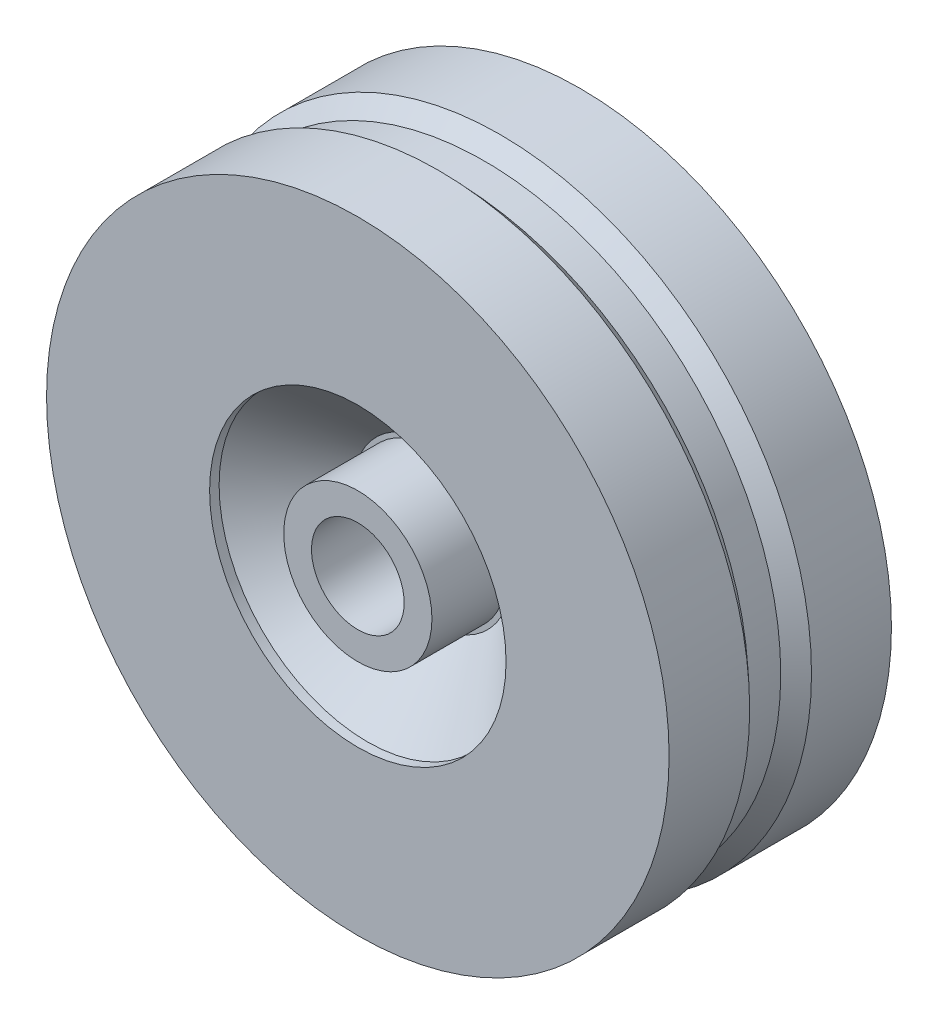
ISO-10303-21;
HEADER;
FILE_DESCRIPTION(('STEP AP214'),'2;1');
FILE_NAME('part.step','',(''),(''),'','','');
FILE_SCHEMA(('AUTOMOTIVE_DESIGN { 1 0 10303 214 1 1 1 1 }'));
ENDSEC;
DATA;
#1=APPLICATION_CONTEXT('core data for automotive mechanical design processes');
#2=APPLICATION_PROTOCOL_DEFINITION('international standard','automotive_design',2000,#1);
#3=PRODUCT_CONTEXT('',#1,'mechanical');
#4=PRODUCT('Part','Part','',(#3));
#5=PRODUCT_RELATED_PRODUCT_CATEGORY('part','',(#4));
#6=PRODUCT_DEFINITION_FORMATION('','',#4);
#7=PRODUCT_DEFINITION_CONTEXT('part definition',#1,'design');
#8=PRODUCT_DEFINITION('design','',#6,#7);
#9=PRODUCT_DEFINITION_SHAPE('','',#8);
#10=(LENGTH_UNIT() NAMED_UNIT(*) SI_UNIT(.MILLI.,.METRE.));
#11=(NAMED_UNIT(*) PLANE_ANGLE_UNIT() SI_UNIT($,.RADIAN.));
#12=(NAMED_UNIT(*) SI_UNIT($,.STERADIAN.) SOLID_ANGLE_UNIT());
#13=UNCERTAINTY_MEASURE_WITH_UNIT(LENGTH_MEASURE(1.E-05),#10,'distance_accuracy_value','');
#14=(GEOMETRIC_REPRESENTATION_CONTEXT(3) GLOBAL_UNCERTAINTY_ASSIGNED_CONTEXT((#13)) GLOBAL_UNIT_ASSIGNED_CONTEXT((#10,
#11,#12)) REPRESENTATION_CONTEXT('',''));
#15=CARTESIAN_POINT('',(0.,0.,0.));
#16=DIRECTION('',(0.,0.,1.));
#17=DIRECTION('',(1.,0.,0.));
#18=AXIS2_PLACEMENT_3D('',#15,#16,#17);
#19=CARTESIAN_POINT('',(0.,0.,10.));
#20=DIRECTION('',(0.,0.,1.));
#21=DIRECTION('',(1.,0.,0.));
#22=AXIS2_PLACEMENT_3D('',#19,#20,#21);
#23=PLANE('',#22);
#24=CARTESIAN_POINT('',(0.,0.,10.));
#25=DIRECTION('',(0.,0.,1.));
#26=DIRECTION('',(1.,0.,0.));
#27=AXIS2_PLACEMENT_3D('',#24,#25,#26);
#28=CIRCLE('',#27,5.);
#29=CARTESIAN_POINT('',(5.,0.,10.));
#30=VERTEX_POINT('',#29);
#31=EDGE_CURVE('E59',#30,#30,#28,.T.);
#32=ORIENTED_EDGE('',*,*,#31,.F.);
#33=EDGE_LOOP('',(#32));
#34=FACE_BOUND('',#33,.T.);
#35=CARTESIAN_POINT('',(0.,0.,10.));
#36=DIRECTION('',(0.,0.,1.));
#37=DIRECTION('',(1.,0.,0.));
#38=AXIS2_PLACEMENT_3D('',#35,#36,#37);
#39=CIRCLE('',#38,5.31076107784422);
#40=CARTESIAN_POINT('',(5.31076107784422,0.,10.));
#41=VERTEX_POINT('',#40);
#42=EDGE_CURVE('E46',#41,#41,#39,.F.);
#43=ORIENTED_EDGE('',*,*,#42,.F.);
#44=EDGE_LOOP('',(#43));
#45=FACE_BOUND('',#44,.T.);
#46=ADVANCED_FACE('F35',(#34,#45),#23,.T.);
#47=CARTESIAN_POINT('',(0.,0.,5.));
#48=DIRECTION('',(0.,0.,-1.));
#49=DIRECTION('',(1.,0.,0.));
#50=AXIS2_PLACEMENT_3D('',#47,#48,#49);
#51=PLANE('',#50);
#52=CARTESIAN_POINT('',(0.,0.,5.));
#53=DIRECTION('',(0.,0.,1.));
#54=DIRECTION('',(1.,0.,0.));
#55=AXIS2_PLACEMENT_3D('',#52,#53,#54);
#56=CIRCLE('',#55,5.);
#57=CARTESIAN_POINT('',(5.,0.,5.));
#58=VERTEX_POINT('',#57);
#59=EDGE_CURVE('E65',#58,#58,#56,.T.);
#60=ORIENTED_EDGE('',*,*,#59,.T.);
#61=EDGE_LOOP('',(#60));
#62=FACE_BOUND('',#61,.T.);
#63=CARTESIAN_POINT('',(0.,0.,5.));
#64=DIRECTION('',(0.,0.,-1.));
#65=DIRECTION('',(-1.,0.,0.));
#66=AXIS2_PLACEMENT_3D('',#63,#64,#65);
#67=CIRCLE('',#66,6.34806339295763);
#68=CARTESIAN_POINT('',(-6.34806339295763,0.,5.));
#69=VERTEX_POINT('',#68);
#70=EDGE_CURVE('E50',#69,#69,#67,.F.);
#71=ORIENTED_EDGE('',*,*,#70,.F.);
#72=EDGE_LOOP('',(#71));
#73=FACE_BOUND('',#72,.T.);
#74=ADVANCED_FACE('F121',(#62,#73),#51,.T.);
#75=CARTESIAN_POINT('',(0.,0.,0.));
#76=DIRECTION('',(0.,0.,1.));
#77=DIRECTION('',(1.,0.,0.));
#78=AXIS2_PLACEMENT_3D('',#75,#76,#77);
#79=PLANE('',#78);
#80=CARTESIAN_POINT('',(0.,0.,0.));
#81=DIRECTION('',(0.,0.,1.));
#82=DIRECTION('',(1.,0.,0.));
#83=AXIS2_PLACEMENT_3D('',#80,#81,#82);
#84=CIRCLE('',#83,3.125);
#85=CARTESIAN_POINT('',(3.125,0.,0.));
#86=VERTEX_POINT('',#85);
#87=EDGE_CURVE('E56',#86,#86,#84,.T.);
#88=ORIENTED_EDGE('',*,*,#87,.T.);
#89=EDGE_LOOP('',(#88));
#90=FACE_BOUND('',#89,.T.);
#91=CARTESIAN_POINT('',(0.,0.,0.));
#92=DIRECTION('',(0.,0.,1.));
#93=DIRECTION('',(1.,0.,0.));
#94=AXIS2_PLACEMENT_3D('',#91,#92,#93);
#95=CIRCLE('',#94,5.);
#96=CARTESIAN_POINT('',(5.,0.,0.));
#97=VERTEX_POINT('',#96);
#98=EDGE_CURVE('E68',#97,#97,#95,.T.);
#99=ORIENTED_EDGE('',*,*,#98,.F.);
#100=EDGE_LOOP('',(#99));
#101=FACE_BOUND('',#100,.T.);
#102=ADVANCED_FACE('F106',(#90,#101),#79,.F.);
#103=CARTESIAN_POINT('',(0.,0.,15.));
#104=DIRECTION('',(0.,0.,1.));
#105=DIRECTION('',(1.,0.,0.));
#106=AXIS2_PLACEMENT_3D('',#103,#104,#105);
#107=PLANE('',#106);
#108=CARTESIAN_POINT('',(0.,0.,15.));
#109=DIRECTION('',(0.,0.,1.));
#110=DIRECTION('',(1.,0.,0.));
#111=AXIS2_PLACEMENT_3D('',#108,#109,#110);
#112=CIRCLE('',#111,3.125);
#113=CARTESIAN_POINT('',(3.125,0.,15.));
#114=VERTEX_POINT('',#113);
#115=EDGE_CURVE('E55',#114,#114,#112,.T.);
#116=ORIENTED_EDGE('',*,*,#115,.F.);
#117=EDGE_LOOP('',(#116));
#118=FACE_BOUND('',#117,.T.);
#119=CARTESIAN_POINT('',(0.,0.,15.));
#120=DIRECTION('',(0.,0.,1.));
#121=DIRECTION('',(1.,0.,0.));
#122=AXIS2_PLACEMENT_3D('',#119,#120,#121);
#123=CIRCLE('',#122,5.);
#124=CARTESIAN_POINT('',(5.,0.,15.));
#125=VERTEX_POINT('',#124);
#126=EDGE_CURVE('E62',#125,#125,#123,.T.);
#127=ORIENTED_EDGE('',*,*,#126,.T.);
#128=EDGE_LOOP('',(#127));
#129=FACE_BOUND('',#128,.T.);
#130=ADVANCED_FACE('F137',(#118,#129),#107,.T.);
#131=CARTESIAN_POINT('',(0.,0.,15.));
#132=DIRECTION('',(0.,0.,-1.));
#133=DIRECTION('',(-1.,0.,0.));
#134=AXIS2_PLACEMENT_3D('',#131,#132,#133);
#135=CYLINDRICAL_SURFACE('',#134,3.125);
#136=ORIENTED_EDGE('',*,*,#115,.T.);
#137=EDGE_LOOP('',(#136));
#138=FACE_BOUND('',#137,.T.);
#139=ORIENTED_EDGE('',*,*,#87,.F.);
#140=EDGE_LOOP('',(#139));
#141=FACE_BOUND('',#140,.T.);
#142=ADVANCED_FACE('F134',(#138,#141),#135,.F.);
#143=CARTESIAN_POINT('',(0.,0.,10.));
#144=DIRECTION('',(0.,0.,1.));
#145=DIRECTION('',(1.,0.,0.));
#146=AXIS2_PLACEMENT_3D('',#143,#144,#145);
#147=CYLINDRICAL_SURFACE('',#146,5.);
#148=ORIENTED_EDGE('',*,*,#31,.T.);
#149=EDGE_LOOP('',(#148));
#150=FACE_BOUND('',#149,.T.);
#151=ORIENTED_EDGE('',*,*,#126,.F.);
#152=EDGE_LOOP('',(#151));
#153=FACE_BOUND('',#152,.T.);
#154=ADVANCED_FACE('F133',(#150,#153),#147,.T.);
#155=CARTESIAN_POINT('',(0.,0.,5.));
#156=DIRECTION('',(0.,0.,-1.));
#157=DIRECTION('',(-1.,0.,0.));
#158=AXIS2_PLACEMENT_3D('',#155,#156,#157);
#159=CYLINDRICAL_SURFACE('',#158,5.);
#160=ORIENTED_EDGE('',*,*,#59,.F.);
#161=EDGE_LOOP('',(#160));
#162=FACE_BOUND('',#161,.T.);
#163=ORIENTED_EDGE('',*,*,#98,.T.);
#164=EDGE_LOOP('',(#163));
#165=FACE_BOUND('',#164,.T.);
#166=ADVANCED_FACE('F164',(#162,#165),#159,.T.);
#167=CARTESIAN_POINT('',(0.,0.,8.20002132214028));
#168=DIRECTION('',(0.,0.,-1.));
#169=DIRECTION('',(-1.,0.,0.));
#170=AXIS2_PLACEMENT_3D('',#167,#168,#169);
#171=CONICAL_SURFACE('',#170,3.37401630566089,0.748813954104599);
#172=ORIENTED_EDGE('',*,*,#70,.T.);
#173=EDGE_LOOP('',(#172));
#174=FACE_BOUND('',#173,.T.);
#175=CARTESIAN_POINT('',(0.,0.,1.07058171353215));
#176=DIRECTION('',(0.,0.,-1.));
#177=DIRECTION('',(-1.,0.,0.));
#178=AXIS2_PLACEMENT_3D('',#175,#176,#177);
#179=CIRCLE('',#178,10.);
#180=CARTESIAN_POINT('',(-10.,0.,1.07058171353215));
#181=VERTEX_POINT('',#180);
#182=EDGE_CURVE('E71',#181,#181,#179,.T.);
#183=ORIENTED_EDGE('',*,*,#182,.T.);
#184=EDGE_LOOP('',(#183));
#185=FACE_BOUND('',#184,.T.);
#186=ADVANCED_FACE('F169',(#174,#185),#171,.F.);
#187=CARTESIAN_POINT('',(0.,0.,0.));
#188=DIRECTION('',(0.,0.,-1.));
#189=DIRECTION('',(-1.,0.,0.));
#190=AXIS2_PLACEMENT_3D('',#187,#188,#189);
#191=CYLINDRICAL_SURFACE('',#190,10.);
#192=CARTESIAN_POINT('',(0.,0.,0.));
#193=DIRECTION('',(0.,0.,-1.));
#194=DIRECTION('',(-1.,0.,0.));
#195=AXIS2_PLACEMENT_3D('',#192,#193,#194);
#196=CIRCLE('',#195,10.);
#197=CARTESIAN_POINT('',(-10.,0.,0.));
#198=VERTEX_POINT('',#197);
#199=EDGE_CURVE('E94',#198,#198,#196,.T.);
#200=ORIENTED_EDGE('',*,*,#199,.T.);
#201=EDGE_LOOP('',(#200));
#202=FACE_BOUND('',#201,.T.);
#203=ORIENTED_EDGE('',*,*,#182,.F.);
#204=EDGE_LOOP('',(#203));
#205=FACE_BOUND('',#204,.T.);
#206=ADVANCED_FACE('F98',(#202,#205),#191,.F.);
#207=CARTESIAN_POINT('',(0.,0.,0.));
#208=DIRECTION('',(0.,0.,-1.));
#209=DIRECTION('',(-1.,0.,0.));
#210=AXIS2_PLACEMENT_3D('',#207,#208,#209);
#211=CYLINDRICAL_SURFACE('',#210,9.99999999999999);
#212=CARTESIAN_POINT('',(0.,0.,14.3581013856333));
#213=DIRECTION('',(0.,0.,-1.));
#214=DIRECTION('',(-1.,0.,0.));
#215=AXIS2_PLACEMENT_3D('',#212,#213,#214);
#216=CIRCLE('',#215,9.99999999999999);
#217=CARTESIAN_POINT('',(-9.99999999999999,0.,14.3581013856333));
#218=VERTEX_POINT('',#217);
#219=EDGE_CURVE('E76',#218,#218,#216,.T.);
#220=ORIENTED_EDGE('',*,*,#219,.T.);
#221=EDGE_LOOP('',(#220));
#222=FACE_BOUND('',#221,.T.);
#223=CARTESIAN_POINT('',(0.,0.,15.));
#224=DIRECTION('',(0.,0.,-1.));
#225=DIRECTION('',(-1.,0.,0.));
#226=AXIS2_PLACEMENT_3D('',#223,#224,#225);
#227=CIRCLE('',#226,10.);
#228=CARTESIAN_POINT('',(-10.,0.,15.));
#229=VERTEX_POINT('',#228);
#230=EDGE_CURVE('E79',#229,#229,#227,.T.);
#231=ORIENTED_EDGE('',*,*,#230,.F.);
#232=EDGE_LOOP('',(#231));
#233=FACE_BOUND('',#232,.T.);
#234=ADVANCED_FACE('F149',(#222,#233),#211,.F.);
#235=CARTESIAN_POINT('',(0.,0.,14.3581013856333));
#236=DIRECTION('',(0.,0.,1.));
#237=DIRECTION('',(1.,0.,0.));
#238=AXIS2_PLACEMENT_3D('',#235,#236,#237);
#239=CONICAL_SURFACE('',#238,9.99999999999999,0.821982372690301);
#240=ORIENTED_EDGE('',*,*,#42,.T.);
#241=EDGE_LOOP('',(#240));
#242=FACE_BOUND('',#241,.T.);
#243=ORIENTED_EDGE('',*,*,#219,.F.);
#244=EDGE_LOOP('',(#243));
#245=FACE_BOUND('',#244,.T.);
#246=ADVANCED_FACE('F142',(#242,#245),#239,.F.);
#247=ORIENTED_EDGE('',*,*,#230,.T.);
#248=EDGE_LOOP('',(#247));
#249=FACE_BOUND('',#248,.T.);
#250=CARTESIAN_POINT('',(0.,0.,15.));
#251=DIRECTION('',(0.,0.,-1.));
#252=DIRECTION('',(-1.,0.,0.));
#253=AXIS2_PLACEMENT_3D('',#250,#251,#252);
#254=CIRCLE('',#253,21.);
#255=CARTESIAN_POINT('',(-21.,0.,15.));
#256=VERTEX_POINT('',#255);
#257=EDGE_CURVE('E82',#256,#256,#254,.T.);
#258=ORIENTED_EDGE('',*,*,#257,.F.);
#259=EDGE_LOOP('',(#258));
#260=FACE_BOUND('',#259,.T.);
#261=ADVANCED_FACE('F139',(#249,#260),#107,.T.);
#262=CARTESIAN_POINT('',(0.,0.,9.56418986143666));
#263=DIRECTION('',(0.,0.,1.));
#264=DIRECTION('',(1.,0.,0.));
#265=AXIS2_PLACEMENT_3D('',#262,#263,#264);
#266=CONICAL_SURFACE('',#265,21.,0.821982372690301);
#267=CARTESIAN_POINT('',(0.,0.,9.56418986143666));
#268=DIRECTION('',(0.,0.,-1.));
#269=DIRECTION('',(-1.,0.,0.));
#270=AXIS2_PLACEMENT_3D('',#267,#268,#269);
#271=CIRCLE('',#270,21.);
#272=CARTESIAN_POINT('',(-21.,0.,9.56418986143666));
#273=VERTEX_POINT('',#272);
#274=EDGE_CURVE('E85',#273,#273,#271,.T.);
#275=ORIENTED_EDGE('',*,*,#274,.T.);
#276=EDGE_LOOP('',(#275));
#277=FACE_BOUND('',#276,.T.);
#278=CARTESIAN_POINT('',(0.,0.,8.63480633929577));
#279=DIRECTION('',(0.,0.,1.));
#280=DIRECTION('',(1.,0.,0.));
#281=AXIS2_PLACEMENT_3D('',#278,#279,#280);
#282=CIRCLE('',#281,20.);
#283=CARTESIAN_POINT('',(20.,0.,8.63480633929577));
#284=VERTEX_POINT('',#283);
#285=EDGE_CURVE('E10',#284,#284,#282,.T.);
#286=ORIENTED_EDGE('',*,*,#285,.T.);
#287=EDGE_LOOP('',(#286));
#288=FACE_BOUND('',#287,.T.);
#289=ADVANCED_FACE('F141',(#277,#288),#266,.T.);
#290=CARTESIAN_POINT('',(0.,0.,0.));
#291=DIRECTION('',(0.,0.,-1.));
#292=DIRECTION('',(-1.,0.,0.));
#293=AXIS2_PLACEMENT_3D('',#290,#291,#292);
#294=CYLINDRICAL_SURFACE('',#293,21.);
#295=ORIENTED_EDGE('',*,*,#274,.F.);
#296=EDGE_LOOP('',(#295));
#297=FACE_BOUND('',#296,.T.);
#298=ORIENTED_EDGE('',*,*,#257,.T.);
#299=EDGE_LOOP('',(#298));
#300=FACE_BOUND('',#299,.T.);
#301=ADVANCED_FACE('F105',(#297,#300),#294,.T.);
#302=ORIENTED_EDGE('',*,*,#199,.F.);
#303=EDGE_LOOP('',(#302));
#304=FACE_BOUND('',#303,.T.);
#305=CARTESIAN_POINT('',(0.,0.,0.));
#306=DIRECTION('',(0.,0.,-1.));
#307=DIRECTION('',(-1.,0.,0.));
#308=AXIS2_PLACEMENT_3D('',#305,#306,#307);
#309=CIRCLE('',#308,21.);
#310=CARTESIAN_POINT('',(-21.,0.,0.));
#311=VERTEX_POINT('',#310);
#312=EDGE_CURVE('E91',#311,#311,#309,.T.);
#313=ORIENTED_EDGE('',*,*,#312,.T.);
#314=EDGE_LOOP('',(#313));
#315=FACE_BOUND('',#314,.T.);
#316=ADVANCED_FACE('F101',(#304,#315),#79,.F.);
#317=CARTESIAN_POINT('',(0.,0.,7.6310315305752));
#318=DIRECTION('',(0.,0.,-1.));
#319=DIRECTION('',(-1.,0.,0.));
#320=AXIS2_PLACEMENT_3D('',#317,#318,#319);
#321=CONICAL_SURFACE('',#320,18.9199563099545,0.748813954104599);
#322=CARTESIAN_POINT('',(0.,0.,5.39294182864678));
#323=DIRECTION('',(0.,0.,-1.));
#324=DIRECTION('',(-1.,0.,0.));
#325=AXIS2_PLACEMENT_3D('',#322,#323,#324);
#326=CIRCLE('',#325,21.);
#327=CARTESIAN_POINT('',(-21.,0.,5.39294182864678));
#328=VERTEX_POINT('',#327);
#329=EDGE_CURVE('E88',#328,#328,#326,.T.);
#330=ORIENTED_EDGE('',*,*,#329,.F.);
#331=EDGE_LOOP('',(#330));
#332=FACE_BOUND('',#331,.T.);
#333=CARTESIAN_POINT('',(0.,0.,6.46892389221557));
#334=DIRECTION('',(0.,0.,-1.));
#335=DIRECTION('',(-1.,0.,0.));
#336=AXIS2_PLACEMENT_3D('',#333,#334,#335);
#337=CIRCLE('',#336,20.);
#338=CARTESIAN_POINT('',(-20.,0.,6.46892389221557));
#339=VERTEX_POINT('',#338);
#340=EDGE_CURVE('E42',#339,#339,#337,.T.);
#341=ORIENTED_EDGE('',*,*,#340,.T.);
#342=EDGE_LOOP('',(#341));
#343=FACE_BOUND('',#342,.T.);
#344=ADVANCED_FACE('F104',(#332,#343),#321,.T.);
#345=CARTESIAN_POINT('',(0.,0.,0.));
#346=DIRECTION('',(0.,0.,-1.));
#347=DIRECTION('',(-1.,0.,0.));
#348=AXIS2_PLACEMENT_3D('',#345,#346,#347);
#349=CYLINDRICAL_SURFACE('',#348,21.);
#350=ORIENTED_EDGE('',*,*,#312,.F.);
#351=EDGE_LOOP('',(#350));
#352=FACE_BOUND('',#351,.T.);
#353=ORIENTED_EDGE('',*,*,#329,.T.);
#354=EDGE_LOOP('',(#353));
#355=FACE_BOUND('',#354,.T.);
#356=ADVANCED_FACE('F109',(#352,#355),#349,.T.);
#357=CARTESIAN_POINT('',(0.,0.,15.));
#358=DIRECTION('',(0.,0.,-1.));
#359=DIRECTION('',(-1.,0.,0.));
#360=AXIS2_PLACEMENT_3D('',#357,#358,#359);
#361=CYLINDRICAL_SURFACE('',#360,20.);
#362=ORIENTED_EDGE('',*,*,#340,.F.);
#363=EDGE_LOOP('',(#362));
#364=FACE_BOUND('',#363,.T.);
#365=ORIENTED_EDGE('',*,*,#285,.F.);
#366=EDGE_LOOP('',(#365));
#367=FACE_BOUND('',#366,.T.);
#368=ADVANCED_FACE('F37',(#364,#367),#361,.T.);
#369=CLOSED_SHELL('',(#46,#74,#102,#130,#142,#154,#166,#186,#206,#234,#246,#261,#289,#301,#316,
#344,#356,#368));
#370=MANIFOLD_SOLID_BREP('B2',#369);
#371=ADVANCED_BREP_SHAPE_REPRESENTATION('',(#18,#370),#14);
#372=SHAPE_DEFINITION_REPRESENTATION(#9,#371);
ENDSEC;
END-ISO-10303-21;
